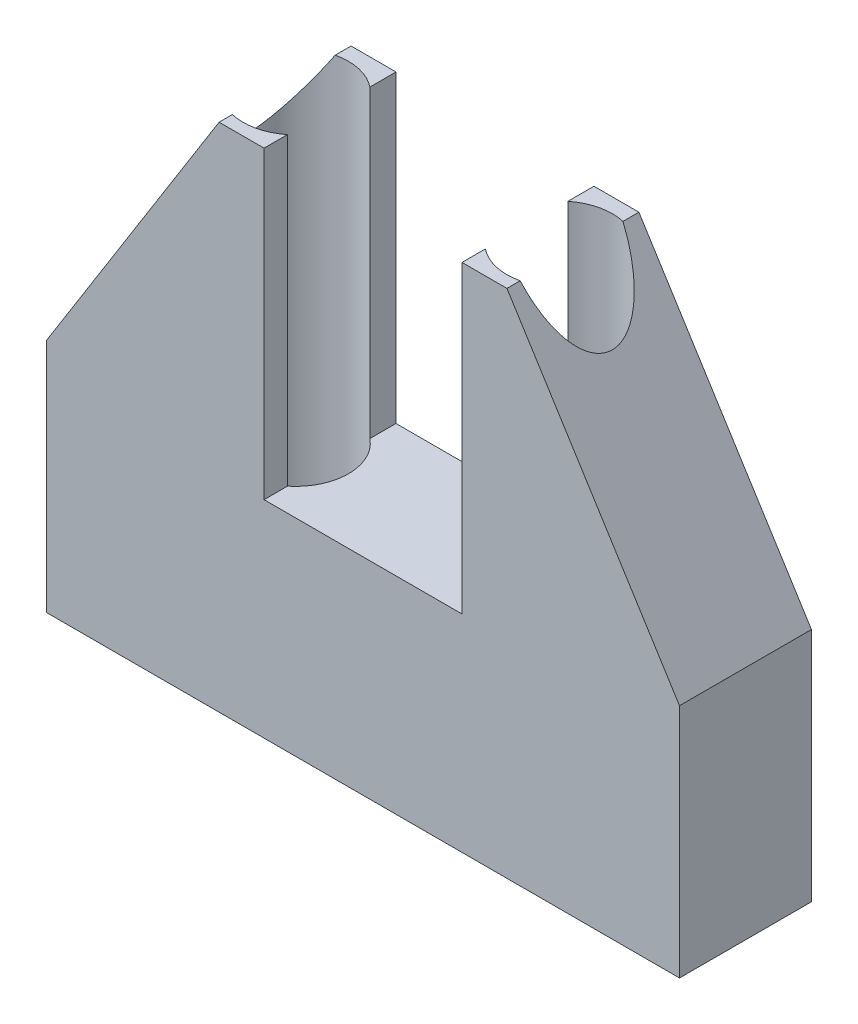
ISO-10303-21;
HEADER;
FILE_DESCRIPTION(('STEP AP214'),'2;1');
FILE_NAME('part.step','',(''),(''),'','','');
FILE_SCHEMA(('AUTOMOTIVE_DESIGN { 1 0 10303 214 1 1 1 1 }'));
ENDSEC;
DATA;
#1=APPLICATION_CONTEXT('core data for automotive mechanical design processes');
#2=APPLICATION_PROTOCOL_DEFINITION('international standard','automotive_design',2000,#1);
#3=PRODUCT_CONTEXT('',#1,'mechanical');
#4=PRODUCT('Part','Part','',(#3));
#5=PRODUCT_RELATED_PRODUCT_CATEGORY('part','',(#4));
#6=PRODUCT_DEFINITION_FORMATION('','',#4);
#7=PRODUCT_DEFINITION_CONTEXT('part definition',#1,'design');
#8=PRODUCT_DEFINITION('design','',#6,#7);
#9=PRODUCT_DEFINITION_SHAPE('','',#8);
#10=(LENGTH_UNIT() NAMED_UNIT(*) SI_UNIT(.MILLI.,.METRE.));
#11=(NAMED_UNIT(*) PLANE_ANGLE_UNIT() SI_UNIT($,.RADIAN.));
#12=(NAMED_UNIT(*) SI_UNIT($,.STERADIAN.) SOLID_ANGLE_UNIT());
#13=UNCERTAINTY_MEASURE_WITH_UNIT(LENGTH_MEASURE(1.E-05),#10,'distance_accuracy_value','');
#14=(GEOMETRIC_REPRESENTATION_CONTEXT(3) GLOBAL_UNCERTAINTY_ASSIGNED_CONTEXT((#13)) GLOBAL_UNIT_ASSIGNED_CONTEXT((#10,
#11,#12)) REPRESENTATION_CONTEXT('',''));
#15=CARTESIAN_POINT('',(0.,0.,0.));
#16=DIRECTION('',(0.,0.,1.));
#17=DIRECTION('',(1.,0.,0.));
#18=AXIS2_PLACEMENT_3D('',#15,#16,#17);
#19=CARTESIAN_POINT('',(-7.5,38.7196686637877,10.));
#20=DIRECTION('',(-1.,0.,0.));
#21=DIRECTION('',(0.,-1.,0.));
#22=AXIS2_PLACEMENT_3D('',#19,#20,#21);
#23=PLANE('',#22);
#24=DIRECTION('',(0.,0.,-1.));
#25=VECTOR('',#24,1.);
#26=CARTESIAN_POINT('',(-7.5,38.7196686637877,10.));
#27=LINE('',#26,#25);
#28=CARTESIAN_POINT('',(-7.5,38.7196686637877,1.979848767037));
#29=VERTEX_POINT('',#28);
#30=CARTESIAN_POINT('',(-7.5,38.7196686637877,0.));
#31=VERTEX_POINT('',#30);
#32=EDGE_CURVE('E178',#29,#31,#27,.T.);
#33=ORIENTED_EDGE('',*,*,#32,.F.);
#34=DIRECTION('',(0.,-1.,0.));
#35=VECTOR('',#34,1.);
#36=CARTESIAN_POINT('',(-7.5,0.,1.979848767037));
#37=LINE('',#36,#35);
#38=CARTESIAN_POINT('',(-7.5,15.6494484656138,1.979848767037));
#39=VERTEX_POINT('',#38);
#40=EDGE_CURVE('E57',#29,#39,#37,.T.);
#41=ORIENTED_EDGE('',*,*,#40,.T.);
#42=DIRECTION('',(0.,0.,-1.));
#43=VECTOR('',#42,1.);
#44=CARTESIAN_POINT('',(-7.5,15.6494484656138,10.));
#45=LINE('',#44,#43);
#46=CARTESIAN_POINT('',(-7.5,15.6494484656138,0.));
#47=VERTEX_POINT('',#46);
#48=EDGE_CURVE('E177',#39,#47,#45,.T.);
#49=ORIENTED_EDGE('',*,*,#48,.T.);
#50=DIRECTION('',(0.,1.,0.));
#51=VECTOR('',#50,1.);
#52=CARTESIAN_POINT('',(-7.5,38.7196686637877,0.));
#53=LINE('',#52,#51);
#54=EDGE_CURVE('E316',#47,#31,#53,.T.);
#55=ORIENTED_EDGE('',*,*,#54,.T.);
#56=EDGE_LOOP('',(#33,#41,#49,#55));
#57=FACE_BOUND('',#56,.T.);
#58=ADVANCED_FACE('F39',(#57),#23,.F.);
#59=CARTESIAN_POINT('',(-10.9062625826872,38.7196686637877,10.));
#60=DIRECTION('',(0.,-1.,0.));
#61=DIRECTION('',(0.,0.,-1.));
#62=AXIS2_PLACEMENT_3D('',#59,#60,#61);
#63=PLANE('',#62);
#64=CARTESIAN_POINT('',(-7.5,38.7196686637877,10.));
#65=VERTEX_POINT('',#64);
#66=CARTESIAN_POINT('',(-7.5,38.7196686637877,8.22484676543538));
#67=VERTEX_POINT('',#66);
#68=EDGE_CURVE('E167',#65,#67,#27,.T.);
#69=ORIENTED_EDGE('',*,*,#68,.T.);
#70=CARTESIAN_POINT('',(-10.,38.7196686637877,5.10234776623619));
#71=DIRECTION('',(0.,-1.,0.));
#72=DIRECTION('',(0.,0.,-1.));
#73=AXIS2_PLACEMENT_3D('',#70,#71,#72);
#74=CIRCLE('',#73,3.99999999999999);
#75=CARTESIAN_POINT('',(-10.9062625826872,38.7196686637877,8.99833135593739));
#76=VERTEX_POINT('',#75);
#77=EDGE_CURVE('E11',#67,#76,#74,.T.);
#78=ORIENTED_EDGE('',*,*,#77,.T.);
#79=DIRECTION('',(0.,0.,-1.));
#80=VECTOR('',#79,1.);
#81=CARTESIAN_POINT('',(-10.9062625826872,38.7196686637877,10.));
#82=LINE('',#81,#80);
#83=CARTESIAN_POINT('',(-10.9062625826872,38.7196686637877,10.));
#84=VERTEX_POINT('',#83);
#85=EDGE_CURVE('E183',#84,#76,#82,.T.);
#86=ORIENTED_EDGE('',*,*,#85,.F.);
#87=DIRECTION('',(-1.,0.,0.));
#88=VECTOR('',#87,1.);
#89=CARTESIAN_POINT('',(-10.9062625826872,38.7196686637877,10.));
#90=LINE('',#89,#88);
#91=EDGE_CURVE('E175',#65,#84,#90,.T.);
#92=ORIENTED_EDGE('',*,*,#91,.F.);
#93=EDGE_LOOP('',(#69,#78,#86,#92));
#94=FACE_BOUND('',#93,.T.);
#95=ADVANCED_FACE('F174',(#94),#63,.F.);
#96=CARTESIAN_POINT('',(10.9062625826872,38.7196686637877,10.));
#97=DIRECTION('',(0.,-1.,0.));
#98=DIRECTION('',(0.,0.,-1.));
#99=AXIS2_PLACEMENT_3D('',#96,#97,#98);
#100=PLANE('',#99);
#101=DIRECTION('',(0.,0.,-1.));
#102=VECTOR('',#101,1.);
#103=CARTESIAN_POINT('',(10.9062625826872,38.7196686637877,10.));
#104=LINE('',#103,#102);
#105=CARTESIAN_POINT('',(10.9062625826872,38.7196686637877,10.));
#106=VERTEX_POINT('',#105);
#107=CARTESIAN_POINT('',(10.9062625826872,38.7196686637877,8.99833135593739));
#108=VERTEX_POINT('',#107);
#109=EDGE_CURVE('E199',#106,#108,#104,.T.);
#110=ORIENTED_EDGE('',*,*,#109,.T.);
#111=CARTESIAN_POINT('',(10.,38.7196686637877,5.10234776623619));
#112=DIRECTION('',(0.,-1.,0.));
#113=DIRECTION('',(0.,0.,-1.));
#114=AXIS2_PLACEMENT_3D('',#111,#112,#113);
#115=CIRCLE('',#114,3.99999999999999);
#116=CARTESIAN_POINT('',(7.5,38.7196686637877,8.22484676543538));
#117=VERTEX_POINT('',#116);
#118=EDGE_CURVE('E246',#108,#117,#115,.T.);
#119=ORIENTED_EDGE('',*,*,#118,.T.);
#120=DIRECTION('',(0.,0.,-1.));
#121=VECTOR('',#120,1.);
#122=CARTESIAN_POINT('',(7.5,38.7196686637877,10.));
#123=LINE('',#122,#121);
#124=CARTESIAN_POINT('',(7.5,38.7196686637877,10.));
#125=VERTEX_POINT('',#124);
#126=EDGE_CURVE('E194',#125,#117,#123,.T.);
#127=ORIENTED_EDGE('',*,*,#126,.F.);
#128=DIRECTION('',(-1.,0.,0.));
#129=VECTOR('',#128,1.);
#130=CARTESIAN_POINT('',(10.9062625826872,38.7196686637877,10.));
#131=LINE('',#130,#129);
#132=EDGE_CURVE('E273',#106,#125,#131,.T.);
#133=ORIENTED_EDGE('',*,*,#132,.F.);
#134=EDGE_LOOP('',(#110,#119,#127,#133));
#135=FACE_BOUND('',#134,.T.);
#136=ADVANCED_FACE('F380',(#135),#100,.F.);
#137=CARTESIAN_POINT('',(7.5,38.7196686637877,10.));
#138=DIRECTION('',(1.,0.,0.));
#139=DIRECTION('',(0.,1.,0.));
#140=AXIS2_PLACEMENT_3D('',#137,#138,#139);
#141=PLANE('',#140);
#142=ORIENTED_EDGE('',*,*,#126,.T.);
#143=DIRECTION('',(0.,-1.,0.));
#144=VECTOR('',#143,1.);
#145=CARTESIAN_POINT('',(7.5,0.,8.22484676543539));
#146=LINE('',#145,#144);
#147=CARTESIAN_POINT('',(7.5,15.6494484656138,8.22484676543539));
#148=VERTEX_POINT('',#147);
#149=EDGE_CURVE('E43',#117,#148,#146,.T.);
#150=ORIENTED_EDGE('',*,*,#149,.T.);
#151=DIRECTION('',(0.,0.,-1.));
#152=VECTOR('',#151,1.);
#153=CARTESIAN_POINT('',(7.5,15.6494484656138,10.));
#154=LINE('',#153,#152);
#155=CARTESIAN_POINT('',(7.5,15.6494484656138,10.));
#156=VERTEX_POINT('',#155);
#157=EDGE_CURVE('E189',#156,#148,#154,.T.);
#158=ORIENTED_EDGE('',*,*,#157,.F.);
#159=DIRECTION('',(0.,-1.,0.));
#160=VECTOR('',#159,1.);
#161=CARTESIAN_POINT('',(7.5,38.7196686637877,10.));
#162=LINE('',#161,#160);
#163=EDGE_CURVE('E276',#125,#156,#162,.T.);
#164=ORIENTED_EDGE('',*,*,#163,.F.);
#165=EDGE_LOOP('',(#142,#150,#158,#164));
#166=FACE_BOUND('',#165,.T.);
#167=ADVANCED_FACE('F374',(#166),#141,.F.);
#168=CARTESIAN_POINT('',(-23.981742880721,17.8695784588157,10.));
#169=DIRECTION('',(0.847190627168921,-0.531289037377142,0.));
#170=DIRECTION('',(0.531289037377142,0.847190627168921,0.));
#171=AXIS2_PLACEMENT_3D('',#168,#169,#170);
#172=PLANE('',#171);
#173=ORIENTED_EDGE('',*,*,#85,.T.);
#174=CARTESIAN_POINT('',(-10.,40.164790079424,5.10234776623619));
#175=DIRECTION('',(0.847190627168921,-0.531289037377142,0.));
#176=DIRECTION('',(-0.531289037377142,-0.847190627168921,0.));
#177=AXIS2_PLACEMENT_3D('',#174,#175,#176);
#178=ELLIPSE('',#177,7.52885852820739,4.);
#179=CARTESIAN_POINT('',(-10.9062625826872,38.7196686637877,1.206364176535));
#180=VERTEX_POINT('',#179);
#181=EDGE_CURVE('E157',#76,#180,#178,.T.);
#182=ORIENTED_EDGE('',*,*,#181,.T.);
#183=CARTESIAN_POINT('',(-10.9062625826872,38.7196686637877,0.));
#184=VERTEX_POINT('',#183);
#185=EDGE_CURVE('E287',#180,#184,#82,.T.);
#186=ORIENTED_EDGE('',*,*,#185,.T.);
#187=DIRECTION('',(-0.531289037377142,-0.847190627168921,0.));
#188=VECTOR('',#187,1.);
#189=CARTESIAN_POINT('',(-23.981742880721,17.8695784588157,0.));
#190=LINE('',#189,#188);
#191=CARTESIAN_POINT('',(-23.981742880721,17.8695784588157,0.));
#192=VERTEX_POINT('',#191);
#193=EDGE_CURVE('E255',#184,#192,#190,.T.);
#194=ORIENTED_EDGE('',*,*,#193,.T.);
#195=DIRECTION('',(0.,0.,-1.));
#196=VECTOR('',#195,1.);
#197=CARTESIAN_POINT('',(-23.981742880721,17.8695784588157,10.));
#198=LINE('',#197,#196);
#199=CARTESIAN_POINT('',(-23.981742880721,17.8695784588157,10.));
#200=VERTEX_POINT('',#199);
#201=EDGE_CURVE('E215',#200,#192,#198,.T.);
#202=ORIENTED_EDGE('',*,*,#201,.F.);
#203=DIRECTION('',(-0.531289037377142,-0.847190627168921,0.));
#204=VECTOR('',#203,1.);
#205=CARTESIAN_POINT('',(-23.981742880721,17.8695784588157,10.));
#206=LINE('',#205,#204);
#207=EDGE_CURVE('E256',#84,#200,#206,.T.);
#208=ORIENTED_EDGE('',*,*,#207,.F.);
#209=EDGE_LOOP('',(#173,#182,#186,#194,#202,#208));
#210=FACE_BOUND('',#209,.T.);
#211=ADVANCED_FACE('F41',(#210),#172,.F.);
#212=CARTESIAN_POINT('',(-23.981742880721,0.,10.));
#213=DIRECTION('',(1.,0.,0.));
#214=DIRECTION('',(0.,0.,-1.));
#215=AXIS2_PLACEMENT_3D('',#212,#213,#214);
#216=PLANE('',#215);
#217=DIRECTION('',(0.,-1.,0.));
#218=VECTOR('',#217,1.);
#219=CARTESIAN_POINT('',(-23.981742880721,0.,0.));
#220=LINE('',#219,#218);
#221=CARTESIAN_POINT('',(-23.981742880721,0.,0.));
#222=VERTEX_POINT('',#221);
#223=EDGE_CURVE('E291',#192,#222,#220,.T.);
#224=ORIENTED_EDGE('',*,*,#223,.T.);
#225=DIRECTION('',(0.,0.,-1.));
#226=VECTOR('',#225,1.);
#227=CARTESIAN_POINT('',(-23.981742880721,0.,10.));
#228=LINE('',#227,#226);
#229=CARTESIAN_POINT('',(-23.981742880721,0.,10.));
#230=VERTEX_POINT('',#229);
#231=EDGE_CURVE('E211',#230,#222,#228,.T.);
#232=ORIENTED_EDGE('',*,*,#231,.F.);
#233=DIRECTION('',(0.,-1.,0.));
#234=VECTOR('',#233,1.);
#235=CARTESIAN_POINT('',(-23.981742880721,0.,10.));
#236=LINE('',#235,#234);
#237=EDGE_CURVE('E260',#200,#230,#236,.T.);
#238=ORIENTED_EDGE('',*,*,#237,.F.);
#239=ORIENTED_EDGE('',*,*,#201,.T.);
#240=EDGE_LOOP('',(#224,#232,#238,#239));
#241=FACE_BOUND('',#240,.T.);
#242=ADVANCED_FACE('F366',(#241),#216,.F.);
#243=CARTESIAN_POINT('',(-23.981742880721,0.,10.));
#244=DIRECTION('',(0.,1.,0.));
#245=DIRECTION('',(0.,0.,1.));
#246=AXIS2_PLACEMENT_3D('',#243,#244,#245);
#247=PLANE('',#246);
#248=CARTESIAN_POINT('',(-10.,0.,5.10234776623619));
#249=DIRECTION('',(0.,-1.,0.));
#250=DIRECTION('',(0.,0.,-1.));
#251=AXIS2_PLACEMENT_3D('',#248,#249,#250);
#252=CIRCLE('',#251,4.);
#253=CARTESIAN_POINT('',(-10.,0.,1.10234776623619));
#254=VERTEX_POINT('',#253);
#255=EDGE_CURVE('E233',#254,#254,#252,.T.);
#256=ORIENTED_EDGE('',*,*,#255,.F.);
#257=EDGE_LOOP('',(#256));
#258=FACE_BOUND('',#257,.T.);
#259=CARTESIAN_POINT('',(10.,0.,5.10234776623619));
#260=DIRECTION('',(0.,-1.,0.));
#261=DIRECTION('',(0.,0.,-1.));
#262=AXIS2_PLACEMENT_3D('',#259,#260,#261);
#263=CIRCLE('',#262,4.);
#264=CARTESIAN_POINT('',(10.,0.,1.10234776623619));
#265=VERTEX_POINT('',#264);
#266=EDGE_CURVE('E240',#265,#265,#263,.T.);
#267=ORIENTED_EDGE('',*,*,#266,.F.);
#268=EDGE_LOOP('',(#267));
#269=FACE_BOUND('',#268,.T.);
#270=DIRECTION('',(1.,0.,0.));
#271=VECTOR('',#270,1.);
#272=CARTESIAN_POINT('',(-23.981742880721,0.,0.));
#273=LINE('',#272,#271);
#274=CARTESIAN_POINT('',(23.981742880721,0.,0.));
#275=VERTEX_POINT('',#274);
#276=EDGE_CURVE('E294',#222,#275,#273,.T.);
#277=ORIENTED_EDGE('',*,*,#276,.T.);
#278=DIRECTION('',(0.,0.,-1.));
#279=VECTOR('',#278,1.);
#280=CARTESIAN_POINT('',(23.981742880721,0.,10.));
#281=LINE('',#280,#279);
#282=CARTESIAN_POINT('',(23.981742880721,0.,10.));
#283=VERTEX_POINT('',#282);
#284=EDGE_CURVE('E207',#283,#275,#281,.T.);
#285=ORIENTED_EDGE('',*,*,#284,.F.);
#286=DIRECTION('',(1.,0.,0.));
#287=VECTOR('',#286,1.);
#288=CARTESIAN_POINT('',(-23.981742880721,0.,10.));
#289=LINE('',#288,#287);
#290=EDGE_CURVE('E264',#230,#283,#289,.T.);
#291=ORIENTED_EDGE('',*,*,#290,.F.);
#292=ORIENTED_EDGE('',*,*,#231,.T.);
#293=EDGE_LOOP('',(#277,#285,#291,#292));
#294=FACE_BOUND('',#293,.T.);
#295=ADVANCED_FACE('F364',(#258,#269,#294),#247,.F.);
#296=CARTESIAN_POINT('',(23.981742880721,0.,10.));
#297=DIRECTION('',(-1.,0.,0.));
#298=DIRECTION('',(0.,0.,1.));
#299=AXIS2_PLACEMENT_3D('',#296,#297,#298);
#300=PLANE('',#299);
#301=DIRECTION('',(0.,1.,0.));
#302=VECTOR('',#301,1.);
#303=CARTESIAN_POINT('',(23.981742880721,0.,0.));
#304=LINE('',#303,#302);
#305=CARTESIAN_POINT('',(23.981742880721,17.8695784588157,0.));
#306=VERTEX_POINT('',#305);
#307=EDGE_CURVE('E297',#275,#306,#304,.T.);
#308=ORIENTED_EDGE('',*,*,#307,.T.);
#309=DIRECTION('',(0.,0.,-1.));
#310=VECTOR('',#309,1.);
#311=CARTESIAN_POINT('',(23.981742880721,17.8695784588157,10.));
#312=LINE('',#311,#310);
#313=CARTESIAN_POINT('',(23.981742880721,17.8695784588157,10.));
#314=VERTEX_POINT('',#313);
#315=EDGE_CURVE('E203',#314,#306,#312,.T.);
#316=ORIENTED_EDGE('',*,*,#315,.F.);
#317=DIRECTION('',(0.,1.,0.));
#318=VECTOR('',#317,1.);
#319=CARTESIAN_POINT('',(23.981742880721,0.,10.));
#320=LINE('',#319,#318);
#321=EDGE_CURVE('E267',#283,#314,#320,.T.);
#322=ORIENTED_EDGE('',*,*,#321,.F.);
#323=ORIENTED_EDGE('',*,*,#284,.T.);
#324=EDGE_LOOP('',(#308,#316,#322,#323));
#325=FACE_BOUND('',#324,.T.);
#326=ADVANCED_FACE('F360',(#325),#300,.F.);
#327=CARTESIAN_POINT('',(23.981742880721,17.8695784588157,10.));
#328=DIRECTION('',(-0.847190627168921,-0.531289037377142,0.));
#329=DIRECTION('',(0.531289037377142,-0.847190627168921,0.));
#330=AXIS2_PLACEMENT_3D('',#327,#328,#329);
#331=PLANE('',#330);
#332=CARTESIAN_POINT('',(10.9062625826872,38.7196686637877,1.206364176535));
#333=VERTEX_POINT('',#332);
#334=CARTESIAN_POINT('',(10.9062625826872,38.7196686637877,0.));
#335=VERTEX_POINT('',#334);
#336=EDGE_CURVE('E198',#333,#335,#104,.T.);
#337=ORIENTED_EDGE('',*,*,#336,.F.);
#338=CARTESIAN_POINT('',(10.,40.164790079424,5.10234776623619));
#339=DIRECTION('',(-0.847190627168921,-0.531289037377142,0.));
#340=DIRECTION('',(0.531289037377142,-0.847190627168921,0.));
#341=AXIS2_PLACEMENT_3D('',#338,#339,#340);
#342=ELLIPSE('',#341,7.52885852820739,4.);
#343=EDGE_CURVE('E251',#333,#108,#342,.T.);
#344=ORIENTED_EDGE('',*,*,#343,.T.);
#345=ORIENTED_EDGE('',*,*,#109,.F.);
#346=DIRECTION('',(-0.531289037377142,0.847190627168921,0.));
#347=VECTOR('',#346,1.);
#348=CARTESIAN_POINT('',(23.981742880721,17.8695784588157,10.));
#349=LINE('',#348,#347);
#350=EDGE_CURVE('E270',#314,#106,#349,.T.);
#351=ORIENTED_EDGE('',*,*,#350,.F.);
#352=ORIENTED_EDGE('',*,*,#315,.T.);
#353=DIRECTION('',(-0.531289037377142,0.847190627168921,0.));
#354=VECTOR('',#353,1.);
#355=CARTESIAN_POINT('',(23.981742880721,17.8695784588157,0.));
#356=LINE('',#355,#354);
#357=EDGE_CURVE('E300',#306,#335,#356,.T.);
#358=ORIENTED_EDGE('',*,*,#357,.T.);
#359=EDGE_LOOP('',(#337,#344,#345,#351,#352,#358));
#360=FACE_BOUND('',#359,.T.);
#361=ADVANCED_FACE('F354',(#360),#331,.F.);
#362=CARTESIAN_POINT('',(7.5,38.7196686637877,1.979848767037));
#363=VERTEX_POINT('',#362);
#364=CARTESIAN_POINT('',(7.5,38.7196686637877,0.));
#365=VERTEX_POINT('',#364);
#366=EDGE_CURVE('E193',#363,#365,#123,.T.);
#367=ORIENTED_EDGE('',*,*,#366,.F.);
#368=EDGE_CURVE('E65',#363,#333,#115,.T.);
#369=ORIENTED_EDGE('',*,*,#368,.T.);
#370=ORIENTED_EDGE('',*,*,#336,.T.);
#371=DIRECTION('',(-1.,0.,0.));
#372=VECTOR('',#371,1.);
#373=CARTESIAN_POINT('',(10.9062625826872,38.7196686637877,0.));
#374=LINE('',#373,#372);
#375=EDGE_CURVE('E304',#335,#365,#374,.T.);
#376=ORIENTED_EDGE('',*,*,#375,.T.);
#377=EDGE_LOOP('',(#367,#369,#370,#376));
#378=FACE_BOUND('',#377,.T.);
#379=ADVANCED_FACE('F349',(#378),#100,.F.);
#380=CARTESIAN_POINT('',(7.5,15.6494484656138,1.979848767037));
#381=VERTEX_POINT('',#380);
#382=CARTESIAN_POINT('',(7.5,15.6494484656138,0.));
#383=VERTEX_POINT('',#382);
#384=EDGE_CURVE('E188',#381,#383,#154,.T.);
#385=ORIENTED_EDGE('',*,*,#384,.F.);
#386=DIRECTION('',(0.,-1.,0.));
#387=VECTOR('',#386,1.);
#388=CARTESIAN_POINT('',(7.5,0.,1.979848767037));
#389=LINE('',#388,#387);
#390=EDGE_CURVE('E218',#381,#363,#389,.F.);
#391=ORIENTED_EDGE('',*,*,#390,.T.);
#392=ORIENTED_EDGE('',*,*,#366,.T.);
#393=DIRECTION('',(0.,-1.,0.));
#394=VECTOR('',#393,1.);
#395=CARTESIAN_POINT('',(7.5,38.7196686637877,0.));
#396=LINE('',#395,#394);
#397=EDGE_CURVE('E308',#365,#383,#396,.T.);
#398=ORIENTED_EDGE('',*,*,#397,.T.);
#399=EDGE_LOOP('',(#385,#391,#392,#398));
#400=FACE_BOUND('',#399,.T.);
#401=ADVANCED_FACE('F346',(#400),#141,.F.);
#402=CARTESIAN_POINT('',(7.5,15.6494484656138,10.));
#403=DIRECTION('',(0.,-1.,0.));
#404=DIRECTION('',(0.,0.,-1.));
#405=AXIS2_PLACEMENT_3D('',#402,#403,#404);
#406=PLANE('',#405);
#407=ORIENTED_EDGE('',*,*,#48,.F.);
#408=CARTESIAN_POINT('',(-10.,15.6494484656138,5.10234776623619));
#409=DIRECTION('',(0.,-1.,0.));
#410=DIRECTION('',(0.,0.,-1.));
#411=AXIS2_PLACEMENT_3D('',#408,#409,#410);
#412=CIRCLE('',#411,4.);
#413=CARTESIAN_POINT('',(-7.5,15.6494484656138,8.22484676543539));
#414=VERTEX_POINT('',#413);
#415=EDGE_CURVE('E172',#39,#414,#412,.T.);
#416=ORIENTED_EDGE('',*,*,#415,.T.);
#417=CARTESIAN_POINT('',(-7.5,15.6494484656138,10.));
#418=VERTEX_POINT('',#417);
#419=EDGE_CURVE('E170',#418,#414,#45,.T.);
#420=ORIENTED_EDGE('',*,*,#419,.F.);
#421=DIRECTION('',(-1.,0.,0.));
#422=VECTOR('',#421,1.);
#423=CARTESIAN_POINT('',(7.5,15.6494484656138,10.));
#424=LINE('',#423,#422);
#425=EDGE_CURVE('E279',#156,#418,#424,.T.);
#426=ORIENTED_EDGE('',*,*,#425,.F.);
#427=ORIENTED_EDGE('',*,*,#157,.T.);
#428=CARTESIAN_POINT('',(10.,15.6494484656138,5.10234776623619));
#429=DIRECTION('',(0.,-1.,0.));
#430=DIRECTION('',(0.,0.,-1.));
#431=AXIS2_PLACEMENT_3D('',#428,#429,#430);
#432=CIRCLE('',#431,4.);
#433=EDGE_CURVE('E247',#148,#381,#432,.T.);
#434=ORIENTED_EDGE('',*,*,#433,.T.);
#435=ORIENTED_EDGE('',*,*,#384,.T.);
#436=DIRECTION('',(-1.,0.,0.));
#437=VECTOR('',#436,1.);
#438=CARTESIAN_POINT('',(7.5,15.6494484656138,0.));
#439=LINE('',#438,#437);
#440=EDGE_CURVE('E312',#383,#47,#439,.T.);
#441=ORIENTED_EDGE('',*,*,#440,.T.);
#442=EDGE_LOOP('',(#407,#416,#420,#426,#427,#434,#435,#441));
#443=FACE_BOUND('',#442,.T.);
#444=ADVANCED_FACE('F340',(#443),#406,.F.);
#445=ORIENTED_EDGE('',*,*,#419,.T.);
#446=DIRECTION('',(0.,-1.,0.));
#447=VECTOR('',#446,1.);
#448=CARTESIAN_POINT('',(-7.5,0.,8.22484676543539));
#449=LINE('',#448,#447);
#450=EDGE_CURVE('E154',#414,#67,#449,.F.);
#451=ORIENTED_EDGE('',*,*,#450,.T.);
#452=ORIENTED_EDGE('',*,*,#68,.F.);
#453=DIRECTION('',(0.,1.,0.));
#454=VECTOR('',#453,1.);
#455=CARTESIAN_POINT('',(-7.5,38.7196686637877,10.));
#456=LINE('',#455,#454);
#457=EDGE_CURVE('E282',#418,#65,#456,.T.);
#458=ORIENTED_EDGE('',*,*,#457,.F.);
#459=EDGE_LOOP('',(#445,#451,#452,#458));
#460=FACE_BOUND('',#459,.T.);
#461=ADVANCED_FACE('F165',(#460),#23,.F.);
#462=ORIENTED_EDGE('',*,*,#185,.F.);
#463=EDGE_CURVE('E49',#180,#29,#74,.T.);
#464=ORIENTED_EDGE('',*,*,#463,.T.);
#465=ORIENTED_EDGE('',*,*,#32,.T.);
#466=DIRECTION('',(-1.,0.,0.));
#467=VECTOR('',#466,1.);
#468=CARTESIAN_POINT('',(-10.9062625826872,38.7196686637877,0.));
#469=LINE('',#468,#467);
#470=EDGE_CURVE('E261',#31,#184,#469,.T.);
#471=ORIENTED_EDGE('',*,*,#470,.T.);
#472=EDGE_LOOP('',(#462,#464,#465,#471));
#473=FACE_BOUND('',#472,.T.);
#474=ADVANCED_FACE('F323',(#473),#63,.F.);
#475=CARTESIAN_POINT('',(0.,0.,10.));
#476=DIRECTION('',(0.,0.,1.));
#477=DIRECTION('',(1.,0.,0.));
#478=AXIS2_PLACEMENT_3D('',#475,#476,#477);
#479=PLANE('',#478);
#480=ORIENTED_EDGE('',*,*,#207,.T.);
#481=ORIENTED_EDGE('',*,*,#237,.T.);
#482=ORIENTED_EDGE('',*,*,#290,.T.);
#483=ORIENTED_EDGE('',*,*,#321,.T.);
#484=ORIENTED_EDGE('',*,*,#350,.T.);
#485=ORIENTED_EDGE('',*,*,#132,.T.);
#486=ORIENTED_EDGE('',*,*,#163,.T.);
#487=ORIENTED_EDGE('',*,*,#425,.T.);
#488=ORIENTED_EDGE('',*,*,#457,.T.);
#489=ORIENTED_EDGE('',*,*,#91,.T.);
#490=EDGE_LOOP('',(#480,#481,#482,#483,#484,#485,#486,#487,#488,#489));
#491=FACE_BOUND('',#490,.T.);
#492=ADVANCED_FACE('F334',(#491),#479,.T.);
#493=CARTESIAN_POINT('',(0.,0.,0.));
#494=DIRECTION('',(0.,0.,1.));
#495=DIRECTION('',(1.,0.,0.));
#496=AXIS2_PLACEMENT_3D('',#493,#494,#495);
#497=PLANE('',#496);
#498=ORIENTED_EDGE('',*,*,#193,.F.);
#499=ORIENTED_EDGE('',*,*,#470,.F.);
#500=ORIENTED_EDGE('',*,*,#54,.F.);
#501=ORIENTED_EDGE('',*,*,#440,.F.);
#502=ORIENTED_EDGE('',*,*,#397,.F.);
#503=ORIENTED_EDGE('',*,*,#375,.F.);
#504=ORIENTED_EDGE('',*,*,#357,.F.);
#505=ORIENTED_EDGE('',*,*,#307,.F.);
#506=ORIENTED_EDGE('',*,*,#276,.F.);
#507=ORIENTED_EDGE('',*,*,#223,.F.);
#508=EDGE_LOOP('',(#498,#499,#500,#501,#502,#503,#504,#505,#506,#507));
#509=FACE_BOUND('',#508,.T.);
#510=ADVANCED_FACE('F326',(#509),#497,.F.);
#511=CARTESIAN_POINT('',(10.,0.,5.10234776623619));
#512=DIRECTION('',(0.,-1.,0.));
#513=DIRECTION('',(0.,0.,-1.));
#514=AXIS2_PLACEMENT_3D('',#511,#512,#513);
#515=CYLINDRICAL_SURFACE('',#514,4.);
#516=ORIENTED_EDGE('',*,*,#266,.T.);
#517=EDGE_LOOP('',(#516));
#518=FACE_BOUND('',#517,.T.);
#519=ORIENTED_EDGE('',*,*,#368,.F.);
#520=ORIENTED_EDGE('',*,*,#390,.F.);
#521=ORIENTED_EDGE('',*,*,#433,.F.);
#522=ORIENTED_EDGE('',*,*,#149,.F.);
#523=ORIENTED_EDGE('',*,*,#118,.F.);
#524=ORIENTED_EDGE('',*,*,#343,.F.);
#525=EDGE_LOOP('',(#519,#520,#521,#522,#523,#524));
#526=FACE_BOUND('',#525,.T.);
#527=ADVANCED_FACE('F436',(#518,#526),#515,.F.);
#528=CARTESIAN_POINT('',(-10.,0.,5.10234776623619));
#529=DIRECTION('',(0.,-1.,0.));
#530=DIRECTION('',(0.,0.,-1.));
#531=AXIS2_PLACEMENT_3D('',#528,#529,#530);
#532=CYLINDRICAL_SURFACE('',#531,4.);
#533=ORIENTED_EDGE('',*,*,#255,.T.);
#534=EDGE_LOOP('',(#533));
#535=FACE_BOUND('',#534,.T.);
#536=ORIENTED_EDGE('',*,*,#77,.F.);
#537=ORIENTED_EDGE('',*,*,#450,.F.);
#538=ORIENTED_EDGE('',*,*,#415,.F.);
#539=ORIENTED_EDGE('',*,*,#40,.F.);
#540=ORIENTED_EDGE('',*,*,#463,.F.);
#541=ORIENTED_EDGE('',*,*,#181,.F.);
#542=EDGE_LOOP('',(#536,#537,#538,#539,#540,#541));
#543=FACE_BOUND('',#542,.T.);
#544=ADVANCED_FACE('F153',(#535,#543),#532,.F.);
#545=CLOSED_SHELL('',(#58,#95,#136,#167,#211,#242,#295,#326,#361,#379,#401,#444,#461,#474,#492,
#510,#527,#544));
#546=MANIFOLD_SOLID_BREP('B2',#545);
#547=ADVANCED_BREP_SHAPE_REPRESENTATION('',(#18,#546),#14);
#548=SHAPE_DEFINITION_REPRESENTATION(#9,#547);
ENDSEC;
END-ISO-10303-21;
